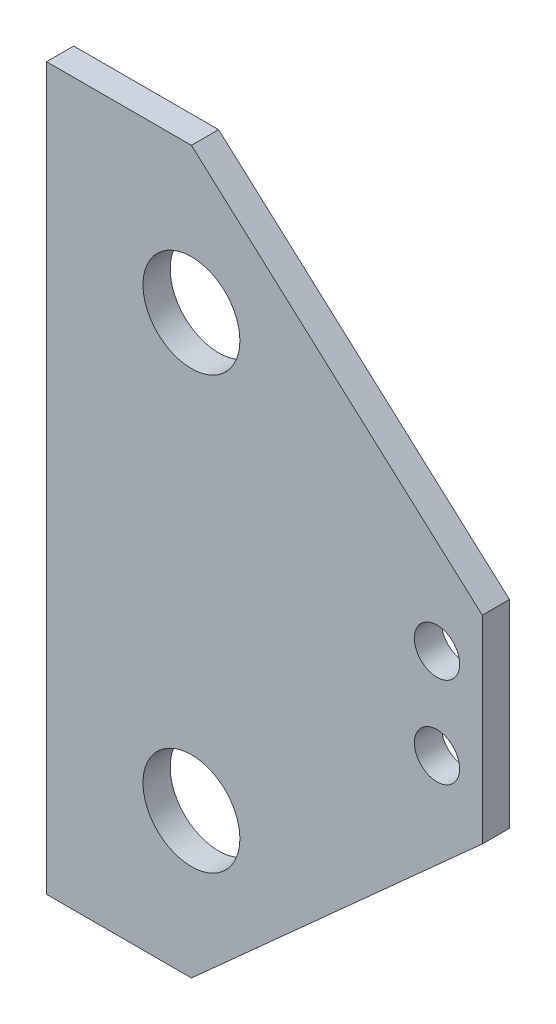
ISO-10303-21;
HEADER;
FILE_DESCRIPTION(('STEP AP214'),'2;1');
FILE_NAME('part.step','',(''),(''),'','','');
FILE_SCHEMA(('AUTOMOTIVE_DESIGN { 1 0 10303 214 1 1 1 1 }'));
ENDSEC;
DATA;
#1=APPLICATION_CONTEXT('core data for automotive mechanical design processes');
#2=APPLICATION_PROTOCOL_DEFINITION('international standard','automotive_design',2000,#1);
#3=PRODUCT_CONTEXT('',#1,'mechanical');
#4=PRODUCT('Part','Part','',(#3));
#5=PRODUCT_RELATED_PRODUCT_CATEGORY('part','',(#4));
#6=PRODUCT_DEFINITION_FORMATION('','',#4);
#7=PRODUCT_DEFINITION_CONTEXT('part definition',#1,'design');
#8=PRODUCT_DEFINITION('design','',#6,#7);
#9=PRODUCT_DEFINITION_SHAPE('','',#8);
#10=(LENGTH_UNIT() NAMED_UNIT(*) SI_UNIT(.MILLI.,.METRE.));
#11=(NAMED_UNIT(*) PLANE_ANGLE_UNIT() SI_UNIT($,.RADIAN.));
#12=(NAMED_UNIT(*) SI_UNIT($,.STERADIAN.) SOLID_ANGLE_UNIT());
#13=UNCERTAINTY_MEASURE_WITH_UNIT(LENGTH_MEASURE(1.E-05),#10,'distance_accuracy_value','');
#14=(GEOMETRIC_REPRESENTATION_CONTEXT(3) GLOBAL_UNCERTAINTY_ASSIGNED_CONTEXT((#13)) GLOBAL_UNIT_ASSIGNED_CONTEXT((#10,
#11,#12)) REPRESENTATION_CONTEXT('',''));
#15=CARTESIAN_POINT('',(0.,0.,0.));
#16=DIRECTION('',(0.,0.,1.));
#17=DIRECTION('',(1.,0.,0.));
#18=AXIS2_PLACEMENT_3D('',#15,#16,#17);
#19=CARTESIAN_POINT('',(29.2514720135185,-32.5388532131401,3.));
#20=DIRECTION('',(-0.668541668916674,0.743674684873774,0.));
#21=DIRECTION('',(-0.743674684873774,-0.668541668916674,0.));
#22=AXIS2_PLACEMENT_3D('',#19,#20,#21);
#23=PLANE('',#22);
#24=DIRECTION('',(0.743674684873774,0.668541668916674,0.));
#25=VECTOR('',#24,1.);
#26=CARTESIAN_POINT('',(29.2514720135185,-32.5388532131401,0.));
#27=LINE('',#26,#25);
#28=CARTESIAN_POINT('',(17.6073053346995,-43.0066165819078,0.));
#29=VERTEX_POINT('',#28);
#30=CARTESIAN_POINT('',(49.7243049901805,-14.1343785092673,0.));
#31=VERTEX_POINT('',#30);
#32=EDGE_CURVE('E150',#29,#31,#27,.T.);
#33=ORIENTED_EDGE('',*,*,#32,.T.);
#34=DIRECTION('',(0.,0.,-1.));
#35=VECTOR('',#34,1.);
#36=CARTESIAN_POINT('',(49.7243049901805,-14.1343785092673,3.));
#37=LINE('',#36,#35);
#38=CARTESIAN_POINT('',(49.7243049901805,-14.1343785092673,3.));
#39=VERTEX_POINT('',#38);
#40=EDGE_CURVE('E11',#39,#31,#37,.T.);
#41=ORIENTED_EDGE('',*,*,#40,.F.);
#42=DIRECTION('',(0.743674684873774,0.668541668916674,0.));
#43=VECTOR('',#42,1.);
#44=CARTESIAN_POINT('',(29.2514720135185,-32.5388532131401,3.));
#45=LINE('',#44,#43);
#46=CARTESIAN_POINT('',(17.6073053346995,-43.0066165819078,3.));
#47=VERTEX_POINT('',#46);
#48=EDGE_CURVE('E185',#47,#39,#45,.T.);
#49=ORIENTED_EDGE('',*,*,#48,.F.);
#50=DIRECTION('',(0.,0.,-1.));
#51=VECTOR('',#50,1.);
#52=CARTESIAN_POINT('',(17.6073053346995,-43.0066165819078,3.));
#53=LINE('',#52,#51);
#54=EDGE_CURVE('E133',#47,#29,#53,.T.);
#55=ORIENTED_EDGE('',*,*,#54,.T.);
#56=EDGE_LOOP('',(#33,#41,#49,#55));
#57=FACE_BOUND('',#56,.T.);
#58=ADVANCED_FACE('F43',(#57),#23,.F.);
#59=CARTESIAN_POINT('',(49.7243049901805,0.,3.));
#60=DIRECTION('',(-1.,0.,0.));
#61=DIRECTION('',(0.,-1.,0.));
#62=AXIS2_PLACEMENT_3D('',#59,#60,#61);
#63=PLANE('',#62);
#64=DIRECTION('',(0.,1.,0.));
#65=VECTOR('',#64,1.);
#66=CARTESIAN_POINT('',(49.7243049901805,0.,0.));
#67=LINE('',#66,#65);
#68=CARTESIAN_POINT('',(49.7243049901805,7.75114534545171,0.));
#69=VERTEX_POINT('',#68);
#70=EDGE_CURVE('E154',#31,#69,#67,.T.);
#71=ORIENTED_EDGE('',*,*,#70,.T.);
#72=DIRECTION('',(0.,0.,-1.));
#73=VECTOR('',#72,1.);
#74=CARTESIAN_POINT('',(49.7243049901805,7.75114534545171,3.));
#75=LINE('',#74,#73);
#76=CARTESIAN_POINT('',(49.7243049901805,7.75114534545171,3.));
#77=VERTEX_POINT('',#76);
#78=EDGE_CURVE('E53',#77,#69,#75,.T.);
#79=ORIENTED_EDGE('',*,*,#78,.F.);
#80=DIRECTION('',(0.,1.,0.));
#81=VECTOR('',#80,1.);
#82=CARTESIAN_POINT('',(49.7243049901805,0.,3.));
#83=LINE('',#82,#81);
#84=EDGE_CURVE('E97',#39,#77,#83,.T.);
#85=ORIENTED_EDGE('',*,*,#84,.F.);
#86=ORIENTED_EDGE('',*,*,#40,.T.);
#87=EDGE_LOOP('',(#71,#79,#85,#86));
#88=FACE_BOUND('',#87,.T.);
#89=ADVANCED_FACE('F178',(#88),#63,.F.);
#90=CARTESIAN_POINT('',(26.0778720117441,29.0085931097431,3.));
#91=DIRECTION('',(0.668541668916674,0.743674684873774,0.));
#92=DIRECTION('',(-0.743674684873775,0.668541668916674,0.));
#93=AXIS2_PLACEMENT_3D('',#90,#91,#92);
#94=PLANE('',#93);
#95=DIRECTION('',(0.743674684873775,-0.668541668916674,0.));
#96=VECTOR('',#95,1.);
#97=CARTESIAN_POINT('',(26.0778720117441,29.0085931097431,0.));
#98=LINE('',#97,#96);
#99=CARTESIAN_POINT('',(17.6073053346995,36.6233834180922,0.));
#100=VERTEX_POINT('',#99);
#101=EDGE_CURVE('E158',#100,#69,#98,.T.);
#102=ORIENTED_EDGE('',*,*,#101,.F.);
#103=DIRECTION('',(0.,0.,-1.));
#104=VECTOR('',#103,1.);
#105=CARTESIAN_POINT('',(17.6073053346995,36.6233834180922,3.));
#106=LINE('',#105,#104);
#107=CARTESIAN_POINT('',(17.6073053346995,36.6233834180922,3.));
#108=VERTEX_POINT('',#107);
#109=EDGE_CURVE('E114',#108,#100,#106,.T.);
#110=ORIENTED_EDGE('',*,*,#109,.F.);
#111=DIRECTION('',(0.743674684873775,-0.668541668916674,0.));
#112=VECTOR('',#111,1.);
#113=CARTESIAN_POINT('',(26.0778720117441,29.0085931097431,3.));
#114=LINE('',#113,#112);
#115=EDGE_CURVE('E124',#108,#77,#114,.T.);
#116=ORIENTED_EDGE('',*,*,#115,.T.);
#117=ORIENTED_EDGE('',*,*,#78,.T.);
#118=EDGE_LOOP('',(#102,#110,#116,#117));
#119=FACE_BOUND('',#118,.T.);
#120=ADVANCED_FACE('F177',(#119),#94,.T.);
#121=CARTESIAN_POINT('',(0.,36.6233834180922,3.));
#122=DIRECTION('',(0.,1.,0.));
#123=DIRECTION('',(0.,0.,1.));
#124=AXIS2_PLACEMENT_3D('',#121,#122,#123);
#125=PLANE('',#124);
#126=DIRECTION('',(1.,0.,0.));
#127=VECTOR('',#126,1.);
#128=CARTESIAN_POINT('',(0.,36.6233834180922,0.));
#129=LINE('',#128,#127);
#130=CARTESIAN_POINT('',(1.60730533469954,36.6233834180922,0.));
#131=VERTEX_POINT('',#130);
#132=EDGE_CURVE('E112',#131,#100,#129,.T.);
#133=ORIENTED_EDGE('',*,*,#132,.F.);
#134=DIRECTION('',(0.,0.,-1.));
#135=VECTOR('',#134,1.);
#136=CARTESIAN_POINT('',(1.60730533469954,36.6233834180922,3.));
#137=LINE('',#136,#135);
#138=CARTESIAN_POINT('',(1.60730533469954,36.6233834180922,3.));
#139=VERTEX_POINT('',#138);
#140=EDGE_CURVE('E106',#139,#131,#137,.T.);
#141=ORIENTED_EDGE('',*,*,#140,.F.);
#142=DIRECTION('',(1.,0.,0.));
#143=VECTOR('',#142,1.);
#144=CARTESIAN_POINT('',(0.,36.6233834180922,3.));
#145=LINE('',#144,#143);
#146=EDGE_CURVE('E110',#139,#108,#145,.T.);
#147=ORIENTED_EDGE('',*,*,#146,.T.);
#148=ORIENTED_EDGE('',*,*,#109,.T.);
#149=EDGE_LOOP('',(#133,#141,#147,#148));
#150=FACE_BOUND('',#149,.T.);
#151=ADVANCED_FACE('F108',(#150),#125,.T.);
#152=CARTESIAN_POINT('',(1.60730533469954,0.,3.));
#153=DIRECTION('',(1.,0.,0.));
#154=DIRECTION('',(0.,1.,0.));
#155=AXIS2_PLACEMENT_3D('',#152,#153,#154);
#156=PLANE('',#155);
#157=DIRECTION('',(0.,-1.,0.));
#158=VECTOR('',#157,1.);
#159=CARTESIAN_POINT('',(1.60730533469954,0.,0.));
#160=LINE('',#159,#158);
#161=CARTESIAN_POINT('',(1.60730533469954,-43.0066165819078,0.));
#162=VERTEX_POINT('',#161);
#163=EDGE_CURVE('E83',#131,#162,#160,.T.);
#164=ORIENTED_EDGE('',*,*,#163,.T.);
#165=DIRECTION('',(0.,0.,-1.));
#166=VECTOR('',#165,1.);
#167=CARTESIAN_POINT('',(1.60730533469954,-43.0066165819078,3.));
#168=LINE('',#167,#166);
#169=CARTESIAN_POINT('',(1.60730533469954,-43.0066165819078,3.));
#170=VERTEX_POINT('',#169);
#171=EDGE_CURVE('E115',#170,#162,#168,.T.);
#172=ORIENTED_EDGE('',*,*,#171,.F.);
#173=DIRECTION('',(0.,-1.,0.));
#174=VECTOR('',#173,1.);
#175=CARTESIAN_POINT('',(1.60730533469954,0.,3.));
#176=LINE('',#175,#174);
#177=EDGE_CURVE('E117',#139,#170,#176,.T.);
#178=ORIENTED_EDGE('',*,*,#177,.F.);
#179=ORIENTED_EDGE('',*,*,#140,.T.);
#180=EDGE_LOOP('',(#164,#172,#178,#179));
#181=FACE_BOUND('',#180,.T.);
#182=ADVANCED_FACE('F118',(#181),#156,.F.);
#183=CARTESIAN_POINT('',(17.6073053346995,20.6233834180922,3.));
#184=DIRECTION('',(0.,0.,-1.));
#185=DIRECTION('',(-1.,0.,0.));
#186=AXIS2_PLACEMENT_3D('',#183,#184,#185);
#187=CYLINDRICAL_SURFACE('',#186,5.35);
#188=CARTESIAN_POINT('',(17.6073053346995,20.6233834180922,3.));
#189=DIRECTION('',(0.,0.,1.));
#190=DIRECTION('',(1.,0.,0.));
#191=AXIS2_PLACEMENT_3D('',#188,#189,#190);
#192=CIRCLE('',#191,5.35);
#193=CARTESIAN_POINT('',(22.9573053346995,20.6233834180922,3.));
#194=VERTEX_POINT('',#193);
#195=EDGE_CURVE('E335',#194,#194,#192,.T.);
#196=ORIENTED_EDGE('',*,*,#195,.T.);
#197=EDGE_LOOP('',(#196));
#198=FACE_BOUND('',#197,.T.);
#199=CARTESIAN_POINT('',(17.6073053346995,20.6233834180922,0.));
#200=DIRECTION('',(0.,0.,1.));
#201=DIRECTION('',(1.,0.,0.));
#202=AXIS2_PLACEMENT_3D('',#199,#200,#201);
#203=CIRCLE('',#202,5.35);
#204=CARTESIAN_POINT('',(22.9573053346995,20.6233834180922,0.));
#205=VERTEX_POINT('',#204);
#206=EDGE_CURVE('E146',#205,#205,#203,.T.);
#207=ORIENTED_EDGE('',*,*,#206,.F.);
#208=EDGE_LOOP('',(#207));
#209=FACE_BOUND('',#208,.T.);
#210=ADVANCED_FACE('F207',(#198,#209),#187,.F.);
#211=CARTESIAN_POINT('',(17.6073053346995,-27.0066165819078,3.));
#212=DIRECTION('',(0.,0.,-1.));
#213=DIRECTION('',(-1.,0.,0.));
#214=AXIS2_PLACEMENT_3D('',#211,#212,#213);
#215=CYLINDRICAL_SURFACE('',#214,5.35);
#216=CARTESIAN_POINT('',(17.6073053346995,-27.0066165819078,3.));
#217=DIRECTION('',(0.,0.,1.));
#218=DIRECTION('',(1.,0.,0.));
#219=AXIS2_PLACEMENT_3D('',#216,#217,#218);
#220=CIRCLE('',#219,5.35);
#221=CARTESIAN_POINT('',(22.9573053346995,-27.0066165819078,3.));
#222=VERTEX_POINT('',#221);
#223=EDGE_CURVE('E330',#222,#222,#220,.T.);
#224=ORIENTED_EDGE('',*,*,#223,.T.);
#225=EDGE_LOOP('',(#224));
#226=FACE_BOUND('',#225,.T.);
#227=CARTESIAN_POINT('',(17.6073053346995,-27.0066165819078,0.));
#228=DIRECTION('',(0.,0.,1.));
#229=DIRECTION('',(1.,0.,0.));
#230=AXIS2_PLACEMENT_3D('',#227,#228,#229);
#231=CIRCLE('',#230,5.35);
#232=CARTESIAN_POINT('',(22.9573053346995,-27.0066165819078,0.));
#233=VERTEX_POINT('',#232);
#234=EDGE_CURVE('E142',#233,#233,#231,.T.);
#235=ORIENTED_EDGE('',*,*,#234,.F.);
#236=EDGE_LOOP('',(#235));
#237=FACE_BOUND('',#236,.T.);
#238=ADVANCED_FACE('F210',(#226,#237),#215,.F.);
#239=CARTESIAN_POINT('',(44.7243049901805,1.80838341809217,3.));
#240=DIRECTION('',(0.,0.,-1.));
#241=DIRECTION('',(-1.,0.,0.));
#242=AXIS2_PLACEMENT_3D('',#239,#240,#241);
#243=CYLINDRICAL_SURFACE('',#242,2.5);
#244=CARTESIAN_POINT('',(44.7243049901805,1.80838341809217,3.));
#245=DIRECTION('',(0.,0.,1.));
#246=DIRECTION('',(1.,0.,0.));
#247=AXIS2_PLACEMENT_3D('',#244,#245,#246);
#248=CIRCLE('',#247,2.5);
#249=CARTESIAN_POINT('',(47.2243049901805,1.80838341809217,3.));
#250=VERTEX_POINT('',#249);
#251=EDGE_CURVE('E221',#250,#250,#248,.T.);
#252=ORIENTED_EDGE('',*,*,#251,.T.);
#253=EDGE_LOOP('',(#252));
#254=FACE_BOUND('',#253,.T.);
#255=CARTESIAN_POINT('',(44.7243049901805,1.80838341809217,0.));
#256=DIRECTION('',(0.,0.,1.));
#257=DIRECTION('',(1.,0.,0.));
#258=AXIS2_PLACEMENT_3D('',#255,#256,#257);
#259=CIRCLE('',#258,2.5);
#260=CARTESIAN_POINT('',(47.2243049901805,1.80838341809217,0.));
#261=VERTEX_POINT('',#260);
#262=EDGE_CURVE('E138',#261,#261,#259,.T.);
#263=ORIENTED_EDGE('',*,*,#262,.F.);
#264=EDGE_LOOP('',(#263));
#265=FACE_BOUND('',#264,.T.);
#266=ADVANCED_FACE('F195',(#254,#265),#243,.F.);
#267=CARTESIAN_POINT('',(44.7243049901805,-8.19161658190783,3.));
#268=DIRECTION('',(0.,0.,-1.));
#269=DIRECTION('',(-1.,0.,0.));
#270=AXIS2_PLACEMENT_3D('',#267,#268,#269);
#271=CYLINDRICAL_SURFACE('',#270,2.5);
#272=CARTESIAN_POINT('',(44.7243049901805,-8.19161658190783,3.));
#273=DIRECTION('',(0.,0.,1.));
#274=DIRECTION('',(1.,0.,0.));
#275=AXIS2_PLACEMENT_3D('',#272,#273,#274);
#276=CIRCLE('',#275,2.5);
#277=CARTESIAN_POINT('',(47.2243049901805,-8.19161658190783,3.));
#278=VERTEX_POINT('',#277);
#279=EDGE_CURVE('E168',#278,#278,#276,.T.);
#280=ORIENTED_EDGE('',*,*,#279,.T.);
#281=EDGE_LOOP('',(#280));
#282=FACE_BOUND('',#281,.T.);
#283=CARTESIAN_POINT('',(44.7243049901805,-8.19161658190783,0.));
#284=DIRECTION('',(0.,0.,1.));
#285=DIRECTION('',(1.,0.,0.));
#286=AXIS2_PLACEMENT_3D('',#283,#284,#285);
#287=CIRCLE('',#286,2.5);
#288=CARTESIAN_POINT('',(47.2243049901805,-8.19161658190783,0.));
#289=VERTEX_POINT('',#288);
#290=EDGE_CURVE('E134',#289,#289,#287,.T.);
#291=ORIENTED_EDGE('',*,*,#290,.F.);
#292=EDGE_LOOP('',(#291));
#293=FACE_BOUND('',#292,.T.);
#294=ADVANCED_FACE('F45',(#282,#293),#271,.F.);
#295=CARTESIAN_POINT('',(0.,-43.0066165819078,3.));
#296=DIRECTION('',(0.,1.,0.));
#297=DIRECTION('',(0.,0.,1.));
#298=AXIS2_PLACEMENT_3D('',#295,#296,#297);
#299=PLANE('',#298);
#300=DIRECTION('',(1.,0.,0.));
#301=VECTOR('',#300,1.);
#302=CARTESIAN_POINT('',(0.,-43.0066165819078,0.));
#303=LINE('',#302,#301);
#304=EDGE_CURVE('E89',#162,#29,#303,.T.);
#305=ORIENTED_EDGE('',*,*,#304,.T.);
#306=ORIENTED_EDGE('',*,*,#54,.F.);
#307=DIRECTION('',(1.,0.,0.));
#308=VECTOR('',#307,1.);
#309=CARTESIAN_POINT('',(0.,-43.0066165819078,3.));
#310=LINE('',#309,#308);
#311=EDGE_CURVE('E61',#170,#47,#310,.T.);
#312=ORIENTED_EDGE('',*,*,#311,.F.);
#313=ORIENTED_EDGE('',*,*,#171,.T.);
#314=EDGE_LOOP('',(#305,#306,#312,#313));
#315=FACE_BOUND('',#314,.T.);
#316=ADVANCED_FACE('F186',(#315),#299,.F.);
#317=CARTESIAN_POINT('',(0.,0.,3.));
#318=DIRECTION('',(0.,0.,1.));
#319=DIRECTION('',(1.,0.,0.));
#320=AXIS2_PLACEMENT_3D('',#317,#318,#319);
#321=PLANE('',#320);
#322=ORIENTED_EDGE('',*,*,#279,.F.);
#323=EDGE_LOOP('',(#322));
#324=FACE_BOUND('',#323,.T.);
#325=ORIENTED_EDGE('',*,*,#251,.F.);
#326=EDGE_LOOP('',(#325));
#327=FACE_BOUND('',#326,.T.);
#328=ORIENTED_EDGE('',*,*,#223,.F.);
#329=EDGE_LOOP('',(#328));
#330=FACE_BOUND('',#329,.T.);
#331=ORIENTED_EDGE('',*,*,#195,.F.);
#332=EDGE_LOOP('',(#331));
#333=FACE_BOUND('',#332,.T.);
#334=ORIENTED_EDGE('',*,*,#48,.T.);
#335=ORIENTED_EDGE('',*,*,#84,.T.);
#336=ORIENTED_EDGE('',*,*,#115,.F.);
#337=ORIENTED_EDGE('',*,*,#146,.F.);
#338=ORIENTED_EDGE('',*,*,#177,.T.);
#339=ORIENTED_EDGE('',*,*,#311,.T.);
#340=EDGE_LOOP('',(#334,#335,#336,#337,#338,#339));
#341=FACE_BOUND('',#340,.T.);
#342=ADVANCED_FACE('F122',(#324,#327,#330,#333,#341),#321,.T.);
#343=CARTESIAN_POINT('',(0.,0.,0.));
#344=DIRECTION('',(0.,0.,1.));
#345=DIRECTION('',(1.,0.,0.));
#346=AXIS2_PLACEMENT_3D('',#343,#344,#345);
#347=PLANE('',#346);
#348=ORIENTED_EDGE('',*,*,#290,.T.);
#349=EDGE_LOOP('',(#348));
#350=FACE_BOUND('',#349,.T.);
#351=ORIENTED_EDGE('',*,*,#262,.T.);
#352=EDGE_LOOP('',(#351));
#353=FACE_BOUND('',#352,.T.);
#354=ORIENTED_EDGE('',*,*,#234,.T.);
#355=EDGE_LOOP('',(#354));
#356=FACE_BOUND('',#355,.T.);
#357=ORIENTED_EDGE('',*,*,#206,.T.);
#358=EDGE_LOOP('',(#357));
#359=FACE_BOUND('',#358,.T.);
#360=ORIENTED_EDGE('',*,*,#32,.F.);
#361=ORIENTED_EDGE('',*,*,#304,.F.);
#362=ORIENTED_EDGE('',*,*,#163,.F.);
#363=ORIENTED_EDGE('',*,*,#132,.T.);
#364=ORIENTED_EDGE('',*,*,#101,.T.);
#365=ORIENTED_EDGE('',*,*,#70,.F.);
#366=EDGE_LOOP('',(#360,#361,#362,#363,#364,#365));
#367=FACE_BOUND('',#366,.T.);
#368=ADVANCED_FACE('F182',(#350,#353,#356,#359,#367),#347,.F.);
#369=CLOSED_SHELL('',(#58,#89,#120,#151,#182,#210,#238,#266,#294,#316,#342,#368));
#370=MANIFOLD_SOLID_BREP('B2',#369);
#371=ADVANCED_BREP_SHAPE_REPRESENTATION('',(#18,#370),#14);
#372=SHAPE_DEFINITION_REPRESENTATION(#9,#371);
ENDSEC;
END-ISO-10303-21;
